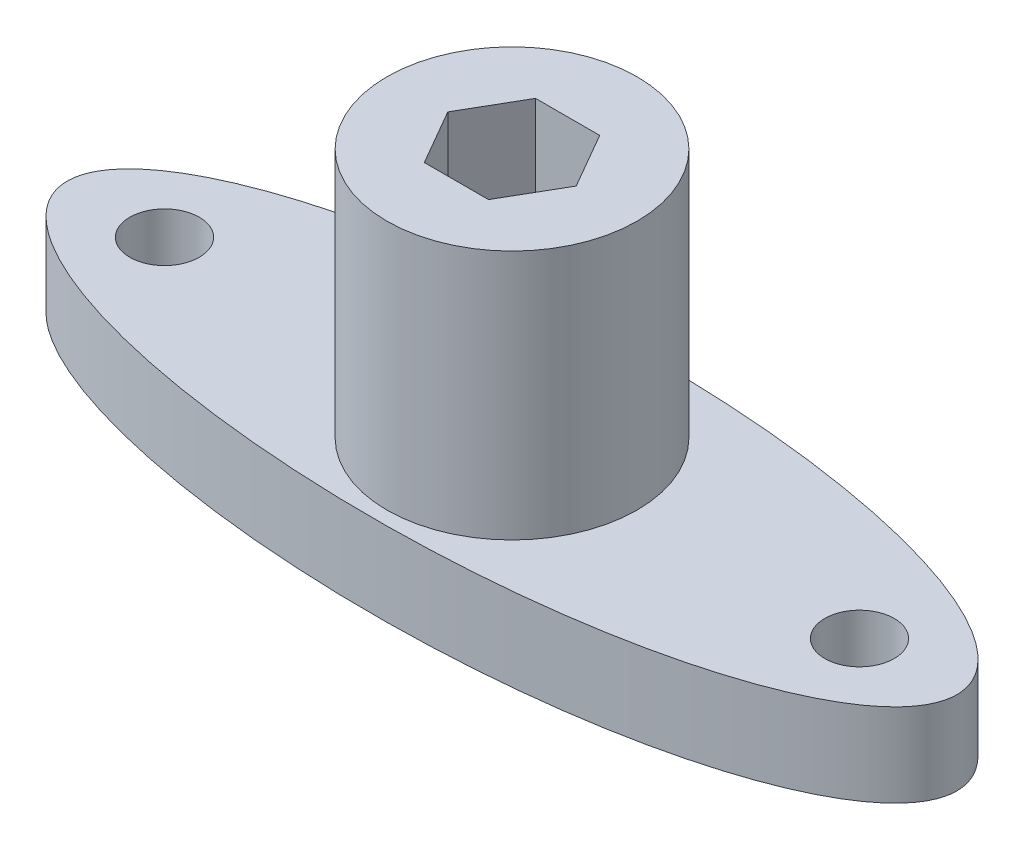
ISO-10303-21;
HEADER;
FILE_DESCRIPTION(('STEP AP214'),'2;1');
FILE_NAME('part.step','',(''),(''),'','','');
FILE_SCHEMA(('AUTOMOTIVE_DESIGN { 1 0 10303 214 1 1 1 1 }'));
ENDSEC;
DATA;
#1=APPLICATION_CONTEXT('core data for automotive mechanical design processes');
#2=APPLICATION_PROTOCOL_DEFINITION('international standard','automotive_design',2000,#1);
#3=PRODUCT_CONTEXT('',#1,'mechanical');
#4=PRODUCT('Part','Part','',(#3));
#5=PRODUCT_RELATED_PRODUCT_CATEGORY('part','',(#4));
#6=PRODUCT_DEFINITION_FORMATION('','',#4);
#7=PRODUCT_DEFINITION_CONTEXT('part definition',#1,'design');
#8=PRODUCT_DEFINITION('design','',#6,#7);
#9=PRODUCT_DEFINITION_SHAPE('','',#8);
#10=(LENGTH_UNIT() NAMED_UNIT(*) SI_UNIT(.MILLI.,.METRE.));
#11=(NAMED_UNIT(*) PLANE_ANGLE_UNIT() SI_UNIT($,.RADIAN.));
#12=(NAMED_UNIT(*) SI_UNIT($,.STERADIAN.) SOLID_ANGLE_UNIT());
#13=UNCERTAINTY_MEASURE_WITH_UNIT(LENGTH_MEASURE(1.E-05),#10,'distance_accuracy_value','');
#14=(GEOMETRIC_REPRESENTATION_CONTEXT(3) GLOBAL_UNCERTAINTY_ASSIGNED_CONTEXT((#13)) GLOBAL_UNIT_ASSIGNED_CONTEXT((#10,
#11,#12)) REPRESENTATION_CONTEXT('',''));
#15=CARTESIAN_POINT('',(0.,0.,0.));
#16=DIRECTION('',(0.,0.,1.));
#17=DIRECTION('',(1.,0.,0.));
#18=AXIS2_PLACEMENT_3D('',#15,#16,#17);
#19=CARTESIAN_POINT('',(15.875,3.81,0.));
#20=DIRECTION('',(0.,-1.,0.));
#21=DIRECTION('',(0.,0.,-1.));
#22=AXIS2_PLACEMENT_3D('',#19,#20,#21);
#23=CYLINDRICAL_SURFACE('',#22,1.5875);
#24=CARTESIAN_POINT('',(15.875,3.81,0.));
#25=DIRECTION('',(0.,1.,0.));
#26=DIRECTION('',(0.,0.,1.));
#27=AXIS2_PLACEMENT_3D('',#24,#25,#26);
#28=CIRCLE('',#27,1.5875);
#29=CARTESIAN_POINT('',(15.875,3.81,-1.5875));
#30=VERTEX_POINT('',#29);
#31=EDGE_CURVE('E169',#30,#30,#28,.T.);
#32=CARTESIAN_POINT('',(15.875,0.,0.));
#33=DIRECTION('',(0.,1.,0.));
#34=DIRECTION('',(0.,0.,1.));
#35=AXIS2_PLACEMENT_3D('',#32,#33,#34);
#36=CIRCLE('',#35,1.5875);
#37=CARTESIAN_POINT('',(15.875,0.,-1.5875));
#38=VERTEX_POINT('',#37);
#39=EDGE_CURVE('E197',#38,#38,#36,.T.);
#40=CARTESIAN_POINT('',(15.875,3.81,-1.5875));
#41=CARTESIAN_POINT('',(15.875,3.7703125,-1.5875));
#42=CARTESIAN_POINT('',(15.875,3.730625,-1.5875));
#43=CARTESIAN_POINT('',(15.875,3.65125,-1.5875));
#44=CARTESIAN_POINT('',(15.875,3.6115625,-1.5875));
#45=CARTESIAN_POINT('',(15.875,3.5321875,-1.5875));
#46=CARTESIAN_POINT('',(15.875,3.4925,-1.5875));
#47=CARTESIAN_POINT('',(15.875,3.413125,-1.5875));
#48=CARTESIAN_POINT('',(15.875,3.3734375,-1.5875));
#49=CARTESIAN_POINT('',(15.875,3.2940625,-1.5875));
#50=CARTESIAN_POINT('',(15.875,3.254375,-1.5875));
#51=CARTESIAN_POINT('',(15.875,3.175,-1.5875));
#52=CARTESIAN_POINT('',(15.875,3.1353125,-1.5875));
#53=CARTESIAN_POINT('',(15.875,3.0559375,-1.5875));
#54=CARTESIAN_POINT('',(15.875,3.01625,-1.5875));
#55=CARTESIAN_POINT('',(15.875,2.936875,-1.5875));
#56=CARTESIAN_POINT('',(15.875,2.8971875,-1.5875));
#57=CARTESIAN_POINT('',(15.875,2.8178125,-1.5875));
#58=CARTESIAN_POINT('',(15.875,2.778125,-1.5875));
#59=CARTESIAN_POINT('',(15.875,2.69875,-1.5875));
#60=CARTESIAN_POINT('',(15.875,2.6590625,-1.5875));
#61=CARTESIAN_POINT('',(15.875,2.5796875,-1.5875));
#62=CARTESIAN_POINT('',(15.875,2.54,-1.5875));
#63=CARTESIAN_POINT('',(15.875,2.460625,-1.5875));
#64=CARTESIAN_POINT('',(15.875,2.4209375,-1.5875));
#65=CARTESIAN_POINT('',(15.875,2.3415625,-1.5875));
#66=CARTESIAN_POINT('',(15.875,2.301875,-1.5875));
#67=CARTESIAN_POINT('',(15.875,2.2225,-1.5875));
#68=CARTESIAN_POINT('',(15.875,2.1828125,-1.5875));
#69=CARTESIAN_POINT('',(15.875,2.1034375,-1.5875));
#70=CARTESIAN_POINT('',(15.875,2.06375,-1.5875));
#71=CARTESIAN_POINT('',(15.875,1.984375,-1.5875));
#72=CARTESIAN_POINT('',(15.875,1.9446875,-1.5875));
#73=CARTESIAN_POINT('',(15.875,1.8653125,-1.5875));
#74=CARTESIAN_POINT('',(15.875,1.825625,-1.5875));
#75=CARTESIAN_POINT('',(15.875,1.74625,-1.5875));
#76=CARTESIAN_POINT('',(15.875,1.7065625,-1.5875));
#77=CARTESIAN_POINT('',(15.875,1.6271875,-1.5875));
#78=CARTESIAN_POINT('',(15.875,1.5875,-1.5875));
#79=CARTESIAN_POINT('',(15.875,1.508125,-1.5875));
#80=CARTESIAN_POINT('',(15.875,1.4684375,-1.5875));
#81=CARTESIAN_POINT('',(15.875,1.3890625,-1.5875));
#82=CARTESIAN_POINT('',(15.875,1.349375,-1.5875));
#83=CARTESIAN_POINT('',(15.875,1.27,-1.5875));
#84=CARTESIAN_POINT('',(15.875,1.2303125,-1.5875));
#85=CARTESIAN_POINT('',(15.875,1.1509375,-1.5875));
#86=CARTESIAN_POINT('',(15.875,1.11125,-1.5875));
#87=CARTESIAN_POINT('',(15.875,1.031875,-1.5875));
#88=CARTESIAN_POINT('',(15.875,0.9921875,-1.5875));
#89=CARTESIAN_POINT('',(15.875,0.9128125,-1.5875));
#90=CARTESIAN_POINT('',(15.875,0.873125,-1.5875));
#91=CARTESIAN_POINT('',(15.875,0.79375,-1.5875));
#92=CARTESIAN_POINT('',(15.875,0.7540625,-1.5875));
#93=CARTESIAN_POINT('',(15.875,0.6746875,-1.5875));
#94=CARTESIAN_POINT('',(15.875,0.635,-1.5875));
#95=CARTESIAN_POINT('',(15.875,0.555625,-1.5875));
#96=CARTESIAN_POINT('',(15.875,0.5159375,-1.5875));
#97=CARTESIAN_POINT('',(15.875,0.4365625,-1.5875));
#98=CARTESIAN_POINT('',(15.875,0.396875,-1.5875));
#99=CARTESIAN_POINT('',(15.875,0.3175,-1.5875));
#100=CARTESIAN_POINT('',(15.875,0.2778125,-1.5875));
#101=CARTESIAN_POINT('',(15.875,0.1984375,-1.5875));
#102=CARTESIAN_POINT('',(15.875,0.15875,-1.5875));
#103=CARTESIAN_POINT('',(15.875,0.0793749999999999,-1.5875));
#104=CARTESIAN_POINT('',(15.875,0.0396874999999999,-1.5875));
#105=CARTESIAN_POINT('',(15.875,0.,-1.5875));
#106=B_SPLINE_CURVE_WITH_KNOTS('',3,(#40,#41,#42,#43,#44,#45,#46,#47,#48,#49,#50,#51,#52,#53,
#54,#55,#56,#57,#58,#59,#60,#61,#62,#63,#64,#65,#66,#67,#68,#69,#70,#71,#72,#73,#74,#75,#76,#77,
#78,#79,#80,#81,#82,#83,#84,#85,#86,#87,#88,#89,#90,#91,#92,#93,#94,#95,#96,#97,#98,#99,#100,
#101,#102,#103,#104,#105),.UNSPECIFIED.,.F.,.F.,(4,2,2,2,2,2,2,2,2,2,2,2,2,2,2,2,2,2,2,2,2,2,2,
2,2,2,2,2,2,2,2,2,4),(0.,0.1190625,0.238125,0.3571875,0.47625,0.5953125,0.714375,0.8334375,
0.9525,1.0715625,1.190625,1.3096875,1.42875,1.5478125,1.666875,1.7859375,1.905,2.0240625,
2.143125,2.2621875,2.38125,2.5003125,2.619375,2.7384375,2.8575,2.9765625,3.095625,3.2146875,
3.33375,3.4528125,3.571875,3.6909375,3.81),.UNSPECIFIED.);
#107=EDGE_CURVE('BSEAM66',#30,#38,#106,.T.);
#108=ORIENTED_EDGE('',*,*,#31,.T.);
#109=ORIENTED_EDGE('',*,*,#39,.F.);
#110=ORIENTED_EDGE('',*,*,#107,.T.);
#111=ORIENTED_EDGE('',*,*,#107,.F.);
#112=EDGE_LOOP('',(#108,#110,#109,#111));
#113=FACE_BOUND('',#112,.T.);
#114=ADVANCED_FACE('F66',(#113),#23,.F.);
#115=CARTESIAN_POINT('',(-15.875,3.81,0.));
#116=DIRECTION('',(0.,-1.,0.));
#117=DIRECTION('',(0.,0.,-1.));
#118=AXIS2_PLACEMENT_3D('',#115,#116,#117);
#119=CYLINDRICAL_SURFACE('',#118,1.5875);
#120=CARTESIAN_POINT('',(-15.875,3.81,0.));
#121=DIRECTION('',(0.,1.,0.));
#122=DIRECTION('',(0.,0.,1.));
#123=AXIS2_PLACEMENT_3D('',#120,#121,#122);
#124=CIRCLE('',#123,1.5875);
#125=CARTESIAN_POINT('',(-15.875,3.81,-1.5875));
#126=VERTEX_POINT('',#125);
#127=EDGE_CURVE('E166',#126,#126,#124,.T.);
#128=CARTESIAN_POINT('',(-15.875,0.,0.));
#129=DIRECTION('',(0.,1.,0.));
#130=DIRECTION('',(0.,0.,1.));
#131=AXIS2_PLACEMENT_3D('',#128,#129,#130);
#132=CIRCLE('',#131,1.5875);
#133=CARTESIAN_POINT('',(-15.875,0.,-1.5875));
#134=VERTEX_POINT('',#133);
#135=EDGE_CURVE('E165',#134,#134,#132,.T.);
#136=CARTESIAN_POINT('',(-15.875,3.81,-1.5875));
#137=CARTESIAN_POINT('',(-15.875,3.7703125,-1.5875));
#138=CARTESIAN_POINT('',(-15.875,3.730625,-1.5875));
#139=CARTESIAN_POINT('',(-15.875,3.65125,-1.5875));
#140=CARTESIAN_POINT('',(-15.875,3.6115625,-1.5875));
#141=CARTESIAN_POINT('',(-15.875,3.5321875,-1.5875));
#142=CARTESIAN_POINT('',(-15.875,3.4925,-1.5875));
#143=CARTESIAN_POINT('',(-15.875,3.413125,-1.5875));
#144=CARTESIAN_POINT('',(-15.875,3.3734375,-1.5875));
#145=CARTESIAN_POINT('',(-15.875,3.2940625,-1.5875));
#146=CARTESIAN_POINT('',(-15.875,3.254375,-1.5875));
#147=CARTESIAN_POINT('',(-15.875,3.175,-1.5875));
#148=CARTESIAN_POINT('',(-15.875,3.1353125,-1.5875));
#149=CARTESIAN_POINT('',(-15.875,3.0559375,-1.5875));
#150=CARTESIAN_POINT('',(-15.875,3.01625,-1.5875));
#151=CARTESIAN_POINT('',(-15.875,2.936875,-1.5875));
#152=CARTESIAN_POINT('',(-15.875,2.8971875,-1.5875));
#153=CARTESIAN_POINT('',(-15.875,2.8178125,-1.5875));
#154=CARTESIAN_POINT('',(-15.875,2.778125,-1.5875));
#155=CARTESIAN_POINT('',(-15.875,2.69875,-1.5875));
#156=CARTESIAN_POINT('',(-15.875,2.6590625,-1.5875));
#157=CARTESIAN_POINT('',(-15.875,2.5796875,-1.5875));
#158=CARTESIAN_POINT('',(-15.875,2.54,-1.5875));
#159=CARTESIAN_POINT('',(-15.875,2.460625,-1.5875));
#160=CARTESIAN_POINT('',(-15.875,2.4209375,-1.5875));
#161=CARTESIAN_POINT('',(-15.875,2.3415625,-1.5875));
#162=CARTESIAN_POINT('',(-15.875,2.301875,-1.5875));
#163=CARTESIAN_POINT('',(-15.875,2.2225,-1.5875));
#164=CARTESIAN_POINT('',(-15.875,2.1828125,-1.5875));
#165=CARTESIAN_POINT('',(-15.875,2.1034375,-1.5875));
#166=CARTESIAN_POINT('',(-15.875,2.06375,-1.5875));
#167=CARTESIAN_POINT('',(-15.875,1.984375,-1.5875));
#168=CARTESIAN_POINT('',(-15.875,1.9446875,-1.5875));
#169=CARTESIAN_POINT('',(-15.875,1.8653125,-1.5875));
#170=CARTESIAN_POINT('',(-15.875,1.825625,-1.5875));
#171=CARTESIAN_POINT('',(-15.875,1.74625,-1.5875));
#172=CARTESIAN_POINT('',(-15.875,1.7065625,-1.5875));
#173=CARTESIAN_POINT('',(-15.875,1.6271875,-1.5875));
#174=CARTESIAN_POINT('',(-15.875,1.5875,-1.5875));
#175=CARTESIAN_POINT('',(-15.875,1.508125,-1.5875));
#176=CARTESIAN_POINT('',(-15.875,1.4684375,-1.5875));
#177=CARTESIAN_POINT('',(-15.875,1.3890625,-1.5875));
#178=CARTESIAN_POINT('',(-15.875,1.349375,-1.5875));
#179=CARTESIAN_POINT('',(-15.875,1.27,-1.5875));
#180=CARTESIAN_POINT('',(-15.875,1.2303125,-1.5875));
#181=CARTESIAN_POINT('',(-15.875,1.1509375,-1.5875));
#182=CARTESIAN_POINT('',(-15.875,1.11125,-1.5875));
#183=CARTESIAN_POINT('',(-15.875,1.031875,-1.5875));
#184=CARTESIAN_POINT('',(-15.875,0.9921875,-1.5875));
#185=CARTESIAN_POINT('',(-15.875,0.9128125,-1.5875));
#186=CARTESIAN_POINT('',(-15.875,0.873125,-1.5875));
#187=CARTESIAN_POINT('',(-15.875,0.79375,-1.5875));
#188=CARTESIAN_POINT('',(-15.875,0.7540625,-1.5875));
#189=CARTESIAN_POINT('',(-15.875,0.6746875,-1.5875));
#190=CARTESIAN_POINT('',(-15.875,0.635,-1.5875));
#191=CARTESIAN_POINT('',(-15.875,0.555625,-1.5875));
#192=CARTESIAN_POINT('',(-15.875,0.5159375,-1.5875));
#193=CARTESIAN_POINT('',(-15.875,0.4365625,-1.5875));
#194=CARTESIAN_POINT('',(-15.875,0.396875,-1.5875));
#195=CARTESIAN_POINT('',(-15.875,0.3175,-1.5875));
#196=CARTESIAN_POINT('',(-15.875,0.2778125,-1.5875));
#197=CARTESIAN_POINT('',(-15.875,0.1984375,-1.5875));
#198=CARTESIAN_POINT('',(-15.875,0.15875,-1.5875));
#199=CARTESIAN_POINT('',(-15.875,0.0793749999999999,-1.5875));
#200=CARTESIAN_POINT('',(-15.875,0.0396874999999999,-1.5875));
#201=CARTESIAN_POINT('',(-15.875,0.,-1.5875));
#202=B_SPLINE_CURVE_WITH_KNOTS('',3,(#136,#137,#138,#139,#140,#141,#142,#143,#144,#145,#146,
#147,#148,#149,#150,#151,#152,#153,#154,#155,#156,#157,#158,#159,#160,#161,#162,#163,#164,#165,
#166,#167,#168,#169,#170,#171,#172,#173,#174,#175,#176,#177,#178,#179,#180,#181,#182,#183,#184,
#185,#186,#187,#188,#189,#190,#191,#192,#193,#194,#195,#196,#197,#198,#199,#200,#201),
.UNSPECIFIED.,.F.,.F.,(4,2,2,2,2,2,2,2,2,2,2,2,2,2,2,2,2,2,2,2,2,2,2,2,2,2,2,2,2,2,2,2,4),(0.,
0.1190625,0.238125,0.3571875,0.47625,0.5953125,0.714375,0.8334375,0.9525,1.0715625,1.190625,
1.3096875,1.42875,1.5478125,1.666875,1.7859375,1.905,2.0240625,2.143125,2.2621875,2.38125,
2.5003125,2.619375,2.7384375,2.8575,2.9765625,3.095625,3.2146875,3.33375,3.4528125,3.571875,
3.6909375,3.81),.UNSPECIFIED.);
#203=EDGE_CURVE('BSEAM68',#126,#134,#202,.T.);
#204=ORIENTED_EDGE('',*,*,#127,.T.);
#205=ORIENTED_EDGE('',*,*,#135,.F.);
#206=ORIENTED_EDGE('',*,*,#203,.T.);
#207=ORIENTED_EDGE('',*,*,#203,.F.);
#208=EDGE_LOOP('',(#204,#206,#205,#207));
#209=FACE_BOUND('',#208,.T.);
#210=ADVANCED_FACE('F68',(#209),#119,.F.);
#211=CARTESIAN_POINT('',(0.,3.81,0.));
#212=DIRECTION('',(0.,1.,0.));
#213=DIRECTION('',(1.,0.,0.));
#214=AXIS2_PLACEMENT_3D('',#211,#212,#213);
#215=ELLIPSE('',#214,20.32,6.35);
#216=DIRECTION('',(0.,-1.,0.));
#217=VECTOR('',#216,1.);
#218=SURFACE_OF_LINEAR_EXTRUSION('',#215,#217);
#219=CARTESIAN_POINT('',(20.32,3.81,0.));
#220=VERTEX_POINT('',#219);
#221=EDGE_CURVE('E173',#220,#220,#215,.T.);
#222=ORIENTED_EDGE('',*,*,#221,.F.);
#223=EDGE_LOOP('',(#222));
#224=FACE_BOUND('',#223,.T.);
#225=CARTESIAN_POINT('',(0.,0.,0.));
#226=DIRECTION('',(0.,1.,0.));
#227=DIRECTION('',(1.,0.,0.));
#228=AXIS2_PLACEMENT_3D('',#225,#226,#227);
#229=ELLIPSE('',#228,20.32,6.35);
#230=CARTESIAN_POINT('',(20.32,0.,0.));
#231=VERTEX_POINT('',#230);
#232=EDGE_CURVE('E170',#231,#231,#229,.T.);
#233=ORIENTED_EDGE('',*,*,#232,.T.);
#234=EDGE_LOOP('',(#233));
#235=FACE_BOUND('',#234,.T.);
#236=ADVANCED_FACE('F180',(#224,#235),#218,.F.);
#237=CARTESIAN_POINT('',(0.,3.81,0.));
#238=DIRECTION('',(0.,1.,0.));
#239=DIRECTION('',(0.,0.,1.));
#240=AXIS2_PLACEMENT_3D('',#237,#238,#239);
#241=PLANE('',#240);
#242=CARTESIAN_POINT('',(0.,3.81,0.));
#243=DIRECTION('',(0.,1.,0.));
#244=DIRECTION('',(0.,0.,1.));
#245=AXIS2_PLACEMENT_3D('',#242,#243,#244);
#246=CIRCLE('',#245,5.715);
#247=CARTESIAN_POINT('',(0.,3.81,-5.715));
#248=VERTEX_POINT('',#247);
#249=EDGE_CURVE('E162',#248,#248,#246,.T.);
#250=ORIENTED_EDGE('',*,*,#249,.F.);
#251=EDGE_LOOP('',(#250));
#252=FACE_BOUND('',#251,.T.);
#253=ORIENTED_EDGE('',*,*,#127,.F.);
#254=EDGE_LOOP('',(#253));
#255=FACE_BOUND('',#254,.T.);
#256=ORIENTED_EDGE('',*,*,#31,.F.);
#257=EDGE_LOOP('',(#256));
#258=FACE_BOUND('',#257,.T.);
#259=ORIENTED_EDGE('',*,*,#221,.T.);
#260=EDGE_LOOP('',(#259));
#261=FACE_BOUND('',#260,.T.);
#262=ADVANCED_FACE('F183',(#252,#255,#258,#261),#241,.T.);
#263=CARTESIAN_POINT('',(0.,0.,0.));
#264=DIRECTION('',(0.,1.,0.));
#265=DIRECTION('',(0.,0.,1.));
#266=AXIS2_PLACEMENT_3D('',#263,#264,#265);
#267=PLANE('',#266);
#268=ORIENTED_EDGE('',*,*,#135,.T.);
#269=EDGE_LOOP('',(#268));
#270=FACE_BOUND('',#269,.T.);
#271=ORIENTED_EDGE('',*,*,#39,.T.);
#272=EDGE_LOOP('',(#271));
#273=FACE_BOUND('',#272,.T.);
#274=ORIENTED_EDGE('',*,*,#232,.F.);
#275=EDGE_LOOP('',(#274));
#276=FACE_BOUND('',#275,.T.);
#277=ADVANCED_FACE('F185',(#270,#273,#276),#267,.F.);
#278=CARTESIAN_POINT('',(0.,7.62,0.));
#279=DIRECTION('',(0.,-1.,0.));
#280=DIRECTION('',(0.,0.,-1.));
#281=AXIS2_PLACEMENT_3D('',#278,#279,#280);
#282=CYLINDRICAL_SURFACE('',#281,5.715);
#283=CARTESIAN_POINT('',(0.,15.24,0.));
#284=DIRECTION('',(0.,1.,0.));
#285=DIRECTION('',(0.,0.,1.));
#286=AXIS2_PLACEMENT_3D('',#283,#284,#285);
#287=CIRCLE('',#286,5.715);
#288=CARTESIAN_POINT('',(0.,15.24,-5.715));
#289=VERTEX_POINT('',#288);
#290=EDGE_CURVE('E150',#289,#289,#287,.T.);
#291=CARTESIAN_POINT('',(0.,3.81,-5.715));
#292=CARTESIAN_POINT('',(0.,3.9290625,-5.715));
#293=CARTESIAN_POINT('',(0.,4.048125,-5.715));
#294=CARTESIAN_POINT('',(0.,4.28625,-5.715));
#295=CARTESIAN_POINT('',(0.,4.4053125,-5.715));
#296=CARTESIAN_POINT('',(0.,4.6434375,-5.715));
#297=CARTESIAN_POINT('',(0.,4.7625,-5.715));
#298=CARTESIAN_POINT('',(0.,5.000625,-5.715));
#299=CARTESIAN_POINT('',(0.,5.1196875,-5.715));
#300=CARTESIAN_POINT('',(0.,5.3578125,-5.715));
#301=CARTESIAN_POINT('',(0.,5.476875,-5.715));
#302=CARTESIAN_POINT('',(0.,5.715,-5.715));
#303=CARTESIAN_POINT('',(0.,5.8340625,-5.715));
#304=CARTESIAN_POINT('',(0.,6.0721875,-5.715));
#305=CARTESIAN_POINT('',(0.,6.19125,-5.715));
#306=CARTESIAN_POINT('',(0.,6.429375,-5.715));
#307=CARTESIAN_POINT('',(0.,6.5484375,-5.715));
#308=CARTESIAN_POINT('',(0.,6.7865625,-5.715));
#309=CARTESIAN_POINT('',(0.,6.905625,-5.715));
#310=CARTESIAN_POINT('',(0.,7.14375,-5.715));
#311=CARTESIAN_POINT('',(0.,7.2628125,-5.715));
#312=CARTESIAN_POINT('',(0.,7.5009375,-5.715));
#313=CARTESIAN_POINT('',(0.,7.62,-5.715));
#314=CARTESIAN_POINT('',(0.,7.858125,-5.715));
#315=CARTESIAN_POINT('',(0.,7.9771875,-5.715));
#316=CARTESIAN_POINT('',(0.,8.2153125,-5.715));
#317=CARTESIAN_POINT('',(0.,8.334375,-5.715));
#318=CARTESIAN_POINT('',(0.,8.5725,-5.715));
#319=CARTESIAN_POINT('',(0.,8.6915625,-5.715));
#320=CARTESIAN_POINT('',(0.,8.9296875,-5.715));
#321=CARTESIAN_POINT('',(0.,9.04875,-5.715));
#322=CARTESIAN_POINT('',(0.,9.286875,-5.715));
#323=CARTESIAN_POINT('',(0.,9.4059375,-5.715));
#324=CARTESIAN_POINT('',(0.,9.6440625,-5.715));
#325=CARTESIAN_POINT('',(0.,9.763125,-5.715));
#326=CARTESIAN_POINT('',(0.,10.00125,-5.715));
#327=CARTESIAN_POINT('',(0.,10.1203125,-5.715));
#328=CARTESIAN_POINT('',(0.,10.3584375,-5.715));
#329=CARTESIAN_POINT('',(0.,10.4775,-5.715));
#330=CARTESIAN_POINT('',(0.,10.715625,-5.715));
#331=CARTESIAN_POINT('',(0.,10.8346875,-5.715));
#332=CARTESIAN_POINT('',(0.,11.0728125,-5.715));
#333=CARTESIAN_POINT('',(0.,11.191875,-5.715));
#334=CARTESIAN_POINT('',(0.,11.43,-5.715));
#335=CARTESIAN_POINT('',(0.,11.5490625,-5.715));
#336=CARTESIAN_POINT('',(0.,11.7871875,-5.715));
#337=CARTESIAN_POINT('',(0.,11.90625,-5.715));
#338=CARTESIAN_POINT('',(0.,12.144375,-5.715));
#339=CARTESIAN_POINT('',(0.,12.2634375,-5.715));
#340=CARTESIAN_POINT('',(0.,12.5015625,-5.715));
#341=CARTESIAN_POINT('',(0.,12.620625,-5.715));
#342=CARTESIAN_POINT('',(0.,12.85875,-5.715));
#343=CARTESIAN_POINT('',(0.,12.9778125,-5.715));
#344=CARTESIAN_POINT('',(0.,13.2159375,-5.715));
#345=CARTESIAN_POINT('',(0.,13.335,-5.715));
#346=CARTESIAN_POINT('',(0.,13.573125,-5.715));
#347=CARTESIAN_POINT('',(0.,13.6921875,-5.715));
#348=CARTESIAN_POINT('',(0.,13.9303125,-5.715));
#349=CARTESIAN_POINT('',(0.,14.049375,-5.715));
#350=CARTESIAN_POINT('',(0.,14.2875,-5.715));
#351=CARTESIAN_POINT('',(0.,14.4065625,-5.715));
#352=CARTESIAN_POINT('',(0.,14.6446875,-5.715));
#353=CARTESIAN_POINT('',(0.,14.76375,-5.715));
#354=CARTESIAN_POINT('',(0.,15.001875,-5.715));
#355=CARTESIAN_POINT('',(0.,15.1209375,-5.715));
#356=CARTESIAN_POINT('',(0.,15.24,-5.715));
#357=B_SPLINE_CURVE_WITH_KNOTS('',3,(#291,#292,#293,#294,#295,#296,#297,#298,#299,#300,#301,
#302,#303,#304,#305,#306,#307,#308,#309,#310,#311,#312,#313,#314,#315,#316,#317,#318,#319,#320,
#321,#322,#323,#324,#325,#326,#327,#328,#329,#330,#331,#332,#333,#334,#335,#336,#337,#338,#339,
#340,#341,#342,#343,#344,#345,#346,#347,#348,#349,#350,#351,#352,#353,#354,#355,#356),
.UNSPECIFIED.,.F.,.F.,(4,2,2,2,2,2,2,2,2,2,2,2,2,2,2,2,2,2,2,2,2,2,2,2,2,2,2,2,2,2,2,2,4),(0.,
0.357187499999999,0.714374999999999,1.0715625,1.42875,1.7859375,2.143125,2.5003125,2.8575,
3.2146875,3.571875,3.9290625,4.28625,4.6434375,5.000625,5.3578125,5.715,6.0721875,6.429375,
6.7865625,7.14375,7.5009375,7.858125,8.2153125,8.5725,8.9296875,9.286875,9.6440625,10.00125,
10.3584375,10.715625,11.0728125,11.43),.UNSPECIFIED.);
#358=EDGE_CURVE('BSEAM240',#248,#289,#357,.T.);
#359=ORIENTED_EDGE('',*,*,#249,.T.);
#360=ORIENTED_EDGE('',*,*,#290,.F.);
#361=ORIENTED_EDGE('',*,*,#358,.T.);
#362=ORIENTED_EDGE('',*,*,#358,.F.);
#363=EDGE_LOOP('',(#359,#361,#360,#362));
#364=FACE_BOUND('',#363,.T.);
#365=ADVANCED_FACE('F240',(#364),#282,.T.);
#366=CARTESIAN_POINT('',(0.,15.24,0.));
#367=DIRECTION('',(0.,1.,0.));
#368=DIRECTION('',(0.,0.,1.));
#369=AXIS2_PLACEMENT_3D('',#366,#367,#368);
#370=PLANE('',#369);
#371=DIRECTION('',(-0.5,0.,0.866025403784439));
#372=VECTOR('',#371,1.);
#373=CARTESIAN_POINT('',(2.19970452561247,15.24,1.27));
#374=LINE('',#373,#372);
#375=CARTESIAN_POINT('',(2.9329393674833,15.24,0.));
#376=VERTEX_POINT('',#375);
#377=CARTESIAN_POINT('',(1.46646968374165,15.24,2.54));
#378=VERTEX_POINT('',#377);
#379=EDGE_CURVE('E120',#376,#378,#374,.T.);
#380=ORIENTED_EDGE('',*,*,#379,.T.);
#381=DIRECTION('',(-1.,0.,0.));
#382=VECTOR('',#381,1.);
#383=CARTESIAN_POINT('',(0.,15.24,2.54));
#384=LINE('',#383,#382);
#385=CARTESIAN_POINT('',(-1.46646968374165,15.24,2.54));
#386=VERTEX_POINT('',#385);
#387=EDGE_CURVE('E128',#378,#386,#384,.T.);
#388=ORIENTED_EDGE('',*,*,#387,.T.);
#389=DIRECTION('',(-0.5,0.,-0.866025403784439));
#390=VECTOR('',#389,1.);
#391=CARTESIAN_POINT('',(-2.19970452561247,15.24,1.27));
#392=LINE('',#391,#390);
#393=CARTESIAN_POINT('',(-2.9329393674833,15.24,0.));
#394=VERTEX_POINT('',#393);
#395=EDGE_CURVE('E133',#386,#394,#392,.T.);
#396=ORIENTED_EDGE('',*,*,#395,.T.);
#397=DIRECTION('',(0.5,0.,-0.866025403784439));
#398=VECTOR('',#397,1.);
#399=CARTESIAN_POINT('',(-2.19970452561247,15.24,-1.27));
#400=LINE('',#399,#398);
#401=CARTESIAN_POINT('',(-1.46646968374165,15.24,-2.54));
#402=VERTEX_POINT('',#401);
#403=EDGE_CURVE('E142',#394,#402,#400,.T.);
#404=ORIENTED_EDGE('',*,*,#403,.T.);
#405=DIRECTION('',(1.,0.,0.));
#406=VECTOR('',#405,1.);
#407=CARTESIAN_POINT('',(0.,15.24,-2.54));
#408=LINE('',#407,#406);
#409=CARTESIAN_POINT('',(1.46646968374165,15.24,-2.54));
#410=VERTEX_POINT('',#409);
#411=EDGE_CURVE('E145',#402,#410,#408,.T.);
#412=ORIENTED_EDGE('',*,*,#411,.T.);
#413=DIRECTION('',(0.5,0.,0.866025403784439));
#414=VECTOR('',#413,1.);
#415=CARTESIAN_POINT('',(2.19970452561247,15.24,-1.27));
#416=LINE('',#415,#414);
#417=EDGE_CURVE('E124',#410,#376,#416,.T.);
#418=ORIENTED_EDGE('',*,*,#417,.T.);
#419=EDGE_LOOP('',(#380,#388,#396,#404,#412,#418));
#420=FACE_BOUND('',#419,.T.);
#421=ORIENTED_EDGE('',*,*,#290,.T.);
#422=EDGE_LOOP('',(#421));
#423=FACE_BOUND('',#422,.T.);
#424=ADVANCED_FACE('F135',(#420,#423),#370,.T.);
#425=CARTESIAN_POINT('',(2.19970452561247,15.24,1.27));
#426=DIRECTION('',(0.866025403784439,0.,0.5));
#427=DIRECTION('',(0.5,0.,-0.866025403784439));
#428=AXIS2_PLACEMENT_3D('',#425,#426,#427);
#429=PLANE('',#428);
#430=DIRECTION('',(0.5,0.,-0.866025403784439));
#431=VECTOR('',#430,1.);
#432=CARTESIAN_POINT('',(2.19970452561247,7.62,1.27));
#433=LINE('',#432,#431);
#434=CARTESIAN_POINT('',(1.46646968374165,7.62,2.54));
#435=VERTEX_POINT('',#434);
#436=CARTESIAN_POINT('',(2.9329393674833,7.62,0.));
#437=VERTEX_POINT('',#436);
#438=EDGE_CURVE('E12',#435,#437,#433,.T.);
#439=ORIENTED_EDGE('',*,*,#438,.F.);
#440=DIRECTION('',(0.,-1.,0.));
#441=VECTOR('',#440,1.);
#442=CARTESIAN_POINT('',(1.46646968374165,15.24,2.54));
#443=LINE('',#442,#441);
#444=EDGE_CURVE('E81',#378,#435,#443,.T.);
#445=ORIENTED_EDGE('',*,*,#444,.F.);
#446=ORIENTED_EDGE('',*,*,#379,.F.);
#447=DIRECTION('',(0.,-1.,0.));
#448=VECTOR('',#447,1.);
#449=CARTESIAN_POINT('',(2.9329393674833,15.24,0.));
#450=LINE('',#449,#448);
#451=EDGE_CURVE('E148',#376,#437,#450,.T.);
#452=ORIENTED_EDGE('',*,*,#451,.T.);
#453=EDGE_LOOP('',(#439,#445,#446,#452));
#454=FACE_BOUND('',#453,.T.);
#455=ADVANCED_FACE('F118',(#454),#429,.F.);
#456=CARTESIAN_POINT('',(2.19970452561247,15.24,-1.27));
#457=DIRECTION('',(0.866025403784439,0.,-0.5));
#458=DIRECTION('',(-0.5,0.,-0.866025403784439));
#459=AXIS2_PLACEMENT_3D('',#456,#457,#458);
#460=PLANE('',#459);
#461=DIRECTION('',(-0.5,0.,-0.866025403784439));
#462=VECTOR('',#461,1.);
#463=CARTESIAN_POINT('',(2.19970452561247,7.62,-1.27));
#464=LINE('',#463,#462);
#465=CARTESIAN_POINT('',(1.46646968374165,7.62,-2.54));
#466=VERTEX_POINT('',#465);
#467=EDGE_CURVE('E74',#437,#466,#464,.T.);
#468=ORIENTED_EDGE('',*,*,#467,.F.);
#469=ORIENTED_EDGE('',*,*,#451,.F.);
#470=ORIENTED_EDGE('',*,*,#417,.F.);
#471=DIRECTION('',(0.,-1.,0.));
#472=VECTOR('',#471,1.);
#473=CARTESIAN_POINT('',(1.46646968374165,15.24,-2.54));
#474=LINE('',#473,#472);
#475=EDGE_CURVE('E151',#410,#466,#474,.T.);
#476=ORIENTED_EDGE('',*,*,#475,.T.);
#477=EDGE_LOOP('',(#468,#469,#470,#476));
#478=FACE_BOUND('',#477,.T.);
#479=ADVANCED_FACE('F222',(#478),#460,.F.);
#480=CARTESIAN_POINT('',(0.,15.24,-2.54));
#481=DIRECTION('',(0.,0.,-1.));
#482=DIRECTION('',(-1.,0.,0.));
#483=AXIS2_PLACEMENT_3D('',#480,#481,#482);
#484=PLANE('',#483);
#485=DIRECTION('',(-1.,0.,0.));
#486=VECTOR('',#485,1.);
#487=CARTESIAN_POINT('',(0.,7.62,-2.54));
#488=LINE('',#487,#486);
#489=CARTESIAN_POINT('',(-1.46646968374165,7.62,-2.54));
#490=VERTEX_POINT('',#489);
#491=EDGE_CURVE('E210',#466,#490,#488,.T.);
#492=ORIENTED_EDGE('',*,*,#491,.F.);
#493=ORIENTED_EDGE('',*,*,#475,.F.);
#494=ORIENTED_EDGE('',*,*,#411,.F.);
#495=DIRECTION('',(0.,-1.,0.));
#496=VECTOR('',#495,1.);
#497=CARTESIAN_POINT('',(-1.46646968374165,15.24,-2.54));
#498=LINE('',#497,#496);
#499=EDGE_CURVE('E153',#402,#490,#498,.T.);
#500=ORIENTED_EDGE('',*,*,#499,.T.);
#501=EDGE_LOOP('',(#492,#493,#494,#500));
#502=FACE_BOUND('',#501,.T.);
#503=ADVANCED_FACE('F221',(#502),#484,.F.);
#504=CARTESIAN_POINT('',(-2.19970452561247,15.24,-1.27));
#505=DIRECTION('',(-0.866025403784439,0.,-0.5));
#506=DIRECTION('',(-0.5,0.,0.866025403784439));
#507=AXIS2_PLACEMENT_3D('',#504,#505,#506);
#508=PLANE('',#507);
#509=DIRECTION('',(-0.5,0.,0.866025403784439));
#510=VECTOR('',#509,1.);
#511=CARTESIAN_POINT('',(-2.19970452561247,7.62,-1.27));
#512=LINE('',#511,#510);
#513=CARTESIAN_POINT('',(-2.9329393674833,7.62,0.));
#514=VERTEX_POINT('',#513);
#515=EDGE_CURVE('E207',#490,#514,#512,.T.);
#516=ORIENTED_EDGE('',*,*,#515,.F.);
#517=ORIENTED_EDGE('',*,*,#499,.F.);
#518=ORIENTED_EDGE('',*,*,#403,.F.);
#519=DIRECTION('',(0.,-1.,0.));
#520=VECTOR('',#519,1.);
#521=CARTESIAN_POINT('',(-2.9329393674833,15.24,0.));
#522=LINE('',#521,#520);
#523=EDGE_CURVE('E156',#394,#514,#522,.T.);
#524=ORIENTED_EDGE('',*,*,#523,.T.);
#525=EDGE_LOOP('',(#516,#517,#518,#524));
#526=FACE_BOUND('',#525,.T.);
#527=ADVANCED_FACE('F219',(#526),#508,.F.);
#528=CARTESIAN_POINT('',(-2.19970452561247,15.24,1.27));
#529=DIRECTION('',(-0.866025403784439,0.,0.5));
#530=DIRECTION('',(0.5,0.,0.866025403784439));
#531=AXIS2_PLACEMENT_3D('',#528,#529,#530);
#532=PLANE('',#531);
#533=DIRECTION('',(0.5,0.,0.866025403784439));
#534=VECTOR('',#533,1.);
#535=CARTESIAN_POINT('',(-2.19970452561247,7.62,1.27));
#536=LINE('',#535,#534);
#537=CARTESIAN_POINT('',(-1.46646968374165,7.62,2.54));
#538=VERTEX_POINT('',#537);
#539=EDGE_CURVE('E204',#514,#538,#536,.T.);
#540=ORIENTED_EDGE('',*,*,#539,.F.);
#541=ORIENTED_EDGE('',*,*,#523,.F.);
#542=ORIENTED_EDGE('',*,*,#395,.F.);
#543=DIRECTION('',(0.,-1.,0.));
#544=VECTOR('',#543,1.);
#545=CARTESIAN_POINT('',(-1.46646968374165,15.24,2.54));
#546=LINE('',#545,#544);
#547=EDGE_CURVE('E123',#386,#538,#546,.T.);
#548=ORIENTED_EDGE('',*,*,#547,.T.);
#549=EDGE_LOOP('',(#540,#541,#542,#548));
#550=FACE_BOUND('',#549,.T.);
#551=ADVANCED_FACE('F215',(#550),#532,.F.);
#552=CARTESIAN_POINT('',(0.,15.24,2.54));
#553=DIRECTION('',(0.,0.,1.));
#554=DIRECTION('',(1.,0.,0.));
#555=AXIS2_PLACEMENT_3D('',#552,#553,#554);
#556=PLANE('',#555);
#557=DIRECTION('',(1.,0.,0.));
#558=VECTOR('',#557,1.);
#559=CARTESIAN_POINT('',(0.,7.62,2.54));
#560=LINE('',#559,#558);
#561=EDGE_CURVE('E177',#538,#435,#560,.T.);
#562=ORIENTED_EDGE('',*,*,#561,.F.);
#563=ORIENTED_EDGE('',*,*,#547,.F.);
#564=ORIENTED_EDGE('',*,*,#387,.F.);
#565=ORIENTED_EDGE('',*,*,#444,.T.);
#566=EDGE_LOOP('',(#562,#563,#564,#565));
#567=FACE_BOUND('',#566,.T.);
#568=ADVANCED_FACE('F129',(#567),#556,.F.);
#569=CARTESIAN_POINT('',(0.,7.62,0.));
#570=DIRECTION('',(0.,1.,0.));
#571=DIRECTION('',(0.,0.,1.));
#572=AXIS2_PLACEMENT_3D('',#569,#570,#571);
#573=PLANE('',#572);
#574=ORIENTED_EDGE('',*,*,#561,.T.);
#575=ORIENTED_EDGE('',*,*,#438,.T.);
#576=ORIENTED_EDGE('',*,*,#467,.T.);
#577=ORIENTED_EDGE('',*,*,#491,.T.);
#578=ORIENTED_EDGE('',*,*,#515,.T.);
#579=ORIENTED_EDGE('',*,*,#539,.T.);
#580=EDGE_LOOP('',(#574,#575,#576,#577,#578,#579));
#581=FACE_BOUND('',#580,.T.);
#582=ADVANCED_FACE('F213',(#581),#573,.T.);
#583=CLOSED_SHELL('',(#114,#210,#236,#262,#277,#365,#424,#455,#479,#503,#527,#551,#568,#582));
#584=MANIFOLD_SOLID_BREP('B2',#583);
#585=ADVANCED_BREP_SHAPE_REPRESENTATION('',(#18,#584),#14);
#586=SHAPE_DEFINITION_REPRESENTATION(#9,#585);
ENDSEC;
END-ISO-10303-21;
